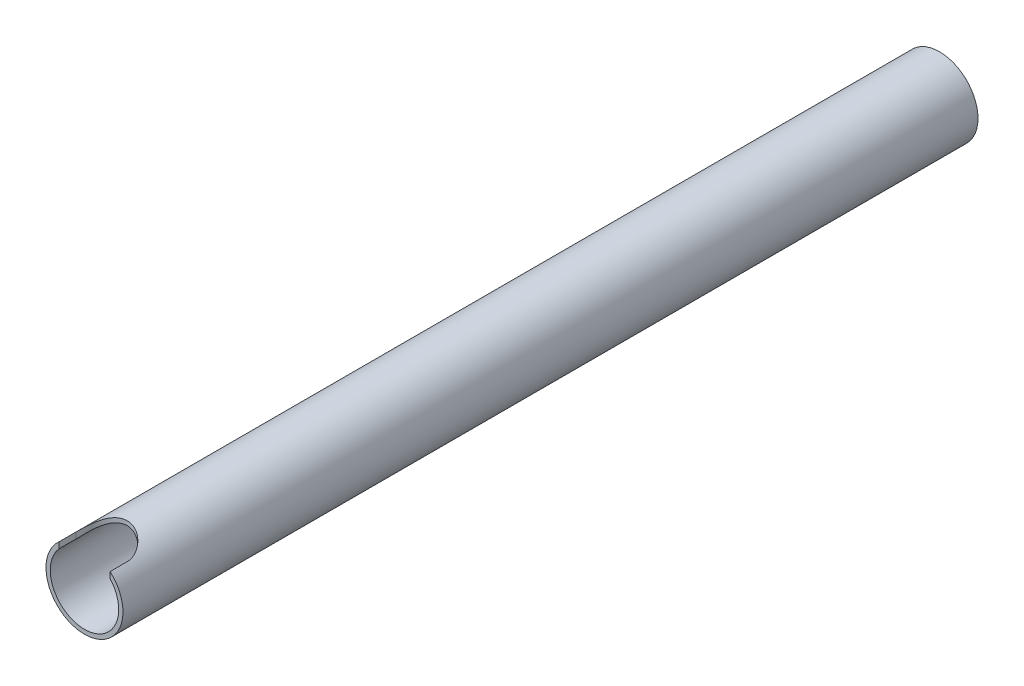
ISO-10303-21;
HEADER;
FILE_DESCRIPTION(('STEP AP214'),'2;1');
FILE_NAME('part.step','',(''),(''),'','','');
FILE_SCHEMA(('AUTOMOTIVE_DESIGN { 1 0 10303 214 1 1 1 1 }'));
ENDSEC;
DATA;
#1=APPLICATION_CONTEXT('core data for automotive mechanical design processes');
#2=APPLICATION_PROTOCOL_DEFINITION('international standard','automotive_design',2000,#1);
#3=PRODUCT_CONTEXT('',#1,'mechanical');
#4=PRODUCT('Part','Part','',(#3));
#5=PRODUCT_RELATED_PRODUCT_CATEGORY('part','',(#4));
#6=PRODUCT_DEFINITION_FORMATION('','',#4);
#7=PRODUCT_DEFINITION_CONTEXT('part definition',#1,'design');
#8=PRODUCT_DEFINITION('design','',#6,#7);
#9=PRODUCT_DEFINITION_SHAPE('','',#8);
#10=(LENGTH_UNIT() NAMED_UNIT(*) SI_UNIT(.MILLI.,.METRE.));
#11=(NAMED_UNIT(*) PLANE_ANGLE_UNIT() SI_UNIT($,.RADIAN.));
#12=(NAMED_UNIT(*) SI_UNIT($,.STERADIAN.) SOLID_ANGLE_UNIT());
#13=UNCERTAINTY_MEASURE_WITH_UNIT(LENGTH_MEASURE(1.E-05),#10,'distance_accuracy_value','');
#14=(GEOMETRIC_REPRESENTATION_CONTEXT(3) GLOBAL_UNCERTAINTY_ASSIGNED_CONTEXT((#13)) GLOBAL_UNIT_ASSIGNED_CONTEXT((#10,
#11,#12)) REPRESENTATION_CONTEXT('',''));
#15=CARTESIAN_POINT('',(0.,0.,0.));
#16=DIRECTION('',(0.,0.,1.));
#17=DIRECTION('',(1.,0.,0.));
#18=AXIS2_PLACEMENT_3D('',#15,#16,#17);
#19=CARTESIAN_POINT('',(0.,0.,200.));
#20=DIRECTION('',(0.,0.,1.));
#21=DIRECTION('',(1.,0.,0.));
#22=AXIS2_PLACEMENT_3D('',#19,#20,#21);
#23=PLANE('',#22);
#24=DIRECTION('',(0.,-1.,0.));
#25=VECTOR('',#24,1.);
#26=CARTESIAN_POINT('',(-6.,0.,200.));
#27=LINE('',#26,#25);
#28=CARTESIAN_POINT('',(-6.,6.70820393249937,200.));
#29=VERTEX_POINT('',#28);
#30=CARTESIAN_POINT('',(-6.,5.29150262212918,200.));
#31=VERTEX_POINT('',#30);
#32=EDGE_CURVE('E118',#29,#31,#27,.T.);
#33=ORIENTED_EDGE('',*,*,#32,.F.);
#34=CARTESIAN_POINT('',(0.,0.,200.));
#35=DIRECTION('',(0.,0.,1.));
#36=DIRECTION('',(1.,0.,0.));
#37=AXIS2_PLACEMENT_3D('',#34,#35,#36);
#38=CIRCLE('',#37,9.);
#39=CARTESIAN_POINT('',(6.,6.70820393249937,200.));
#40=VERTEX_POINT('',#39);
#41=EDGE_CURVE('E177',#29,#40,#38,.T.);
#42=ORIENTED_EDGE('',*,*,#41,.T.);
#43=DIRECTION('',(0.,1.,0.));
#44=VECTOR('',#43,1.);
#45=CARTESIAN_POINT('',(6.,0.,200.));
#46=LINE('',#45,#44);
#47=CARTESIAN_POINT('',(6.,5.29150262212918,200.));
#48=VERTEX_POINT('',#47);
#49=EDGE_CURVE('E103',#48,#40,#46,.T.);
#50=ORIENTED_EDGE('',*,*,#49,.F.);
#51=CARTESIAN_POINT('',(0.,0.,200.));
#52=DIRECTION('',(0.,0.,1.));
#53=DIRECTION('',(1.,0.,0.));
#54=AXIS2_PLACEMENT_3D('',#51,#52,#53);
#55=CIRCLE('',#54,8.);
#56=EDGE_CURVE('E166',#31,#48,#55,.T.);
#57=ORIENTED_EDGE('',*,*,#56,.F.);
#58=EDGE_LOOP('',(#33,#42,#50,#57));
#59=FACE_BOUND('',#58,.T.);
#60=ADVANCED_FACE('F50',(#59),#23,.T.);
#61=CARTESIAN_POINT('',(0.,0.,0.));
#62=DIRECTION('',(0.,0.,1.));
#63=DIRECTION('',(1.,0.,0.));
#64=AXIS2_PLACEMENT_3D('',#61,#62,#63);
#65=PLANE('',#64);
#66=CARTESIAN_POINT('',(0.,0.,0.));
#67=DIRECTION('',(0.,0.,1.));
#68=DIRECTION('',(1.,0.,0.));
#69=AXIS2_PLACEMENT_3D('',#66,#67,#68);
#70=CIRCLE('',#69,9.);
#71=CARTESIAN_POINT('',(9.,0.,0.));
#72=VERTEX_POINT('',#71);
#73=EDGE_CURVE('E162',#72,#72,#70,.T.);
#74=ORIENTED_EDGE('',*,*,#73,.F.);
#75=EDGE_LOOP('',(#74));
#76=FACE_BOUND('',#75,.T.);
#77=CARTESIAN_POINT('',(0.,0.,0.));
#78=DIRECTION('',(0.,0.,1.));
#79=DIRECTION('',(1.,0.,0.));
#80=AXIS2_PLACEMENT_3D('',#77,#78,#79);
#81=CIRCLE('',#80,8.);
#82=CARTESIAN_POINT('',(8.,0.,0.));
#83=VERTEX_POINT('',#82);
#84=EDGE_CURVE('E167',#83,#83,#81,.T.);
#85=ORIENTED_EDGE('',*,*,#84,.T.);
#86=EDGE_LOOP('',(#85));
#87=FACE_BOUND('',#86,.T.);
#88=ADVANCED_FACE('F153',(#76,#87),#65,.F.);
#89=CARTESIAN_POINT('',(0.,0.,200.));
#90=DIRECTION('',(0.,0.,-1.));
#91=DIRECTION('',(-1.,0.,0.));
#92=AXIS2_PLACEMENT_3D('',#89,#90,#91);
#93=CYLINDRICAL_SURFACE('',#92,9.);
#94=ORIENTED_EDGE('',*,*,#41,.F.);
#95=DIRECTION('',(0.,0.,-1.));
#96=VECTOR('',#95,1.);
#97=CARTESIAN_POINT('',(-6.,6.70820393249937,200.));
#98=LINE('',#97,#96);
#99=CARTESIAN_POINT('',(-6.,6.70820393249937,196.));
#100=VERTEX_POINT('',#99);
#101=EDGE_CURVE('E79',#29,#100,#98,.T.);
#102=ORIENTED_EDGE('',*,*,#101,.T.);
#103=CARTESIAN_POINT('',(-6.,6.70820393249937,196.));
#104=CARTESIAN_POINT('',(-6.0000393183433,6.70812194573574,195.852506980731));
#105=CARTESIAN_POINT('',(-5.99456347786238,6.71306593091113,195.705061652411));
#106=CARTESIAN_POINT('',(-5.97289327726244,6.73237859024483,195.411774037341));
#107=CARTESIAN_POINT('',(-5.95671328084198,6.74673463431257,195.265929868277));
#108=CARTESIAN_POINT('',(-5.91415607609064,6.78406215747855,194.978375981598));
#109=CARTESIAN_POINT('',(-5.88788106748825,6.8069472231382,194.836639667377));
#110=CARTESIAN_POINT('',(-5.82560066996816,6.86032556958915,194.556763780513));
#111=CARTESIAN_POINT('',(-5.78959245078331,6.89082106317695,194.418625266884));
#112=CARTESIAN_POINT('',(-5.70858199668009,6.95807725230193,194.147428771933));
#113=CARTESIAN_POINT('',(-5.66362787449207,6.994804284088,194.014347963361));
#114=CARTESIAN_POINT('',(-5.56512538409717,7.07342589112545,193.753028706149));
#115=CARTESIAN_POINT('',(-5.51157745308584,7.11532020347504,193.624790011584));
#116=CARTESIAN_POINT('',(-5.33842689493356,7.24722356567827,193.247177913208));
#117=CARTESIAN_POINT('',(-5.20649519991548,7.34329866853642,193.005493595962));
#118=CARTESIAN_POINT('',(-4.88998497472128,7.55844009542074,192.508915856898));
#119=CARTESIAN_POINT('',(-4.70042231706135,7.67876554502885,192.257747766865));
#120=CARTESIAN_POINT('',(-4.38847297427156,7.85848610554915,191.905379210826));
#121=CARTESIAN_POINT('',(-4.27982876675124,7.91829423228407,191.791937198901));
#122=CARTESIAN_POINT('',(-4.05351803224065,8.03649599254022,191.573519899));
#123=CARTESIAN_POINT('',(-3.93584941894303,8.09488929484438,191.468546580438));
#124=CARTESIAN_POINT('',(-3.67410276883844,8.21734571815794,191.25302928572));
#125=CARTESIAN_POINT('',(-3.52867128211092,8.28100042701004,191.143890846029));
#126=CARTESIAN_POINT('',(-3.22705781179329,8.40312749208883,190.938441866567));
#127=CARTESIAN_POINT('',(-3.07088087836644,8.46160225363382,190.842125362347));
#128=CARTESIAN_POINT('',(-2.7485550368627,8.57172289580967,190.663392008808));
#129=CARTESIAN_POINT('',(-2.58241066290611,8.62337184771766,190.580968903514));
#130=CARTESIAN_POINT('',(-2.24117837103793,8.71828288420858,190.431174670396));
#131=CARTESIAN_POINT('',(-2.06609237981828,8.76154676600818,190.363800316619));
#132=CARTESIAN_POINT('',(-1.72849691899763,8.83395011628131,190.251932590202));
#133=CARTESIAN_POINT('',(-1.56677951763714,8.8641295404735,190.205720420075));
#134=CARTESIAN_POINT('',(-1.23871765597762,8.91589255205311,190.126838317575));
#135=CARTESIAN_POINT('',(-1.0723735087317,8.93747671950317,190.094167471343));
#136=CARTESIAN_POINT('',(-0.736763503715932,8.97137649057705,190.042990402912));
#137=CARTESIAN_POINT('',(-0.567500918238733,8.98370186187713,190.024469252972));
#138=CARTESIAN_POINT('',(-0.227596501670302,8.99872901097531,190.001900549956));
#139=CARTESIAN_POINT('',(-0.056954868589227,9.00143214661064,189.997850954732));
#140=CARTESIAN_POINT('',(0.257909828093748,8.99746462243315,190.003803864367));
#141=CARTESIAN_POINT('',(0.40219455835203,8.99216016134809,190.01175826242));
#142=CARTESIAN_POINT('',(0.689453317178941,8.97470670280735,190.037998856573));
#143=CARTESIAN_POINT('',(0.832426917904149,8.96255554664857,190.056288311231));
#144=CARTESIAN_POINT('',(1.11594062243916,8.93168553622766,190.102940433048));
#145=CARTESIAN_POINT('',(1.25648156409055,8.91296899238517,190.131299556643));
#146=CARTESIAN_POINT('',(1.53431926186213,8.86936580246273,190.197735155283));
#147=CARTESIAN_POINT('',(1.67161473732113,8.84447676380638,190.235815398588));
#148=CARTESIAN_POINT('',(1.94151594437167,8.78916401420626,190.321051852994));
#149=CARTESIAN_POINT('',(2.07413974717568,8.75876529383256,190.368167137181));
#150=CARTESIAN_POINT('',(2.33470201598792,8.69294276948524,190.471092998353));
#151=CARTESIAN_POINT('',(2.46263881729357,8.65751720146291,190.526906628487));
#152=CARTESIAN_POINT('',(2.83849835595443,8.5446597697204,190.706612161669));
#153=CARTESIAN_POINT('',(3.07866953915028,8.46060488844629,190.842832550333));
#154=CARTESIAN_POINT('',(3.56489228702402,8.26853604776286,191.1639488568));
#155=CARTESIAN_POINT('',(3.80756841028923,8.15882511006946,191.35288906415));
#156=CARTESIAN_POINT('',(4.25998331649615,7.93199864466213,191.763721415403));
#157=CARTESIAN_POINT('',(4.46967121585829,7.81487206125219,191.985663457895));
#158=CARTESIAN_POINT('',(4.77234020904544,7.63161953706803,192.359155696051));
#159=CARTESIAN_POINT('',(4.8772295945531,7.56482963236636,192.500887078842));
#160=CARTESIAN_POINT('',(5.07463232509068,7.43385178781524,192.793857940915));
#161=CARTESIAN_POINT('',(5.16714277588728,7.36966445889255,192.945099631629));
#162=CARTESIAN_POINT('',(5.424891961227,7.18436432971937,193.412196144449));
#163=CARTESIAN_POINT('',(5.57088509041259,7.07017210785883,193.742080318463));
#164=CARTESIAN_POINT('',(5.77061895485414,6.90737596649755,194.336081892814));
#165=CARTESIAN_POINT('',(5.83874387569329,6.84936009029308,194.592758129275));
#166=CARTESIAN_POINT('',(5.91517353662353,6.78319958018771,194.985829861502));
#167=CARTESIAN_POINT('',(5.93634841066102,6.76463184262495,195.118054286599));
#168=CARTESIAN_POINT('',(5.96984487292608,6.73509265405631,195.384427253078));
#169=CARTESIAN_POINT('',(5.98217199357155,6.7241164562877,195.518574538489));
#170=CARTESIAN_POINT('',(5.99330844907521,6.71418405629563,195.71085756892));
#171=CARTESIAN_POINT('',(5.99581719087049,6.71194322091241,195.768644375282));
#172=CARTESIAN_POINT('',(5.99916266713708,6.70895310557702,195.884284727289));
#173=CARTESIAN_POINT('',(5.99999998296912,6.708203307008,195.942138242723));
#174=CARTESIAN_POINT('',(6.,6.70820393249937,196.));
#175=B_SPLINE_CURVE_WITH_KNOTS('',3,(#103,#104,#105,#106,#107,#108,#109,#110,#111,#112,#113,
#114,#115,#116,#117,#118,#119,#120,#121,#122,#123,#124,#125,#126,#127,#128,#129,#130,#131,#132,
#133,#134,#135,#136,#137,#138,#139,#140,#141,#142,#143,#144,#145,#146,#147,#148,#149,#150,#151,
#152,#153,#154,#155,#156,#157,#158,#159,#160,#161,#162,#163,#164,#165,#166,#167,#168,#169,#170,
#171,#172,#173,#174),.UNSPECIFIED.,.F.,.F.,(4,2,2,2,2,2,2,2,2,2,2,2,2,2,2,2,2,2,2,2,2,2,2,2,2,2,
2,2,2,2,2,2,2,2,2,4),(0.,0.442218902060999,0.883845599550486,1.32111440562802,1.75851049975334,
2.19361485357492,2.62869707920835,3.50073479655623,4.50746081603578,5.01131940006734,
5.5152948218338,6.09247253881144,6.66938082173012,7.2460286341691,7.82255271359904,
8.33441185130012,8.84623643963211,9.35752031133303,9.86873203059137,10.3020102889807,
10.7354252327199,11.1686878065584,11.6021185844215,12.0336305045627,12.4652942294365,
13.3279876664779,14.3040591784731,15.2816218010343,15.8466542882344,16.411818651815,
17.5394361699494,18.3513876988232,18.7565175336659,19.1613938233755,19.3350122681653,
19.5085703139019),.UNSPECIFIED.);
#176=CARTESIAN_POINT('',(6.,6.70820393249937,196.));
#177=VERTEX_POINT('',#176);
#178=EDGE_CURVE('E108',#100,#177,#175,.T.);
#179=ORIENTED_EDGE('',*,*,#178,.T.);
#180=DIRECTION('',(0.,0.,-1.));
#181=VECTOR('',#180,1.);
#182=CARTESIAN_POINT('',(6.,6.70820393249937,200.));
#183=LINE('',#182,#181);
#184=EDGE_CURVE('E99',#177,#40,#183,.F.);
#185=ORIENTED_EDGE('',*,*,#184,.T.);
#186=EDGE_LOOP('',(#94,#102,#179,#185));
#187=FACE_BOUND('',#186,.T.);
#188=ORIENTED_EDGE('',*,*,#73,.T.);
#189=EDGE_LOOP('',(#188));
#190=FACE_BOUND('',#189,.T.);
#191=ADVANCED_FACE('F47',(#187,#190),#93,.T.);
#192=CARTESIAN_POINT('',(0.,0.,200.));
#193=DIRECTION('',(0.,0.,-1.));
#194=DIRECTION('',(-1.,0.,0.));
#195=AXIS2_PLACEMENT_3D('',#192,#193,#194);
#196=CYLINDRICAL_SURFACE('',#195,8.);
#197=DIRECTION('',(0.,0.,-1.));
#198=VECTOR('',#197,1.);
#199=CARTESIAN_POINT('',(-6.,5.29150262212918,200.));
#200=LINE('',#199,#198);
#201=CARTESIAN_POINT('',(-6.,5.29150262212918,196.));
#202=VERTEX_POINT('',#201);
#203=EDGE_CURVE('E11',#31,#202,#200,.T.);
#204=ORIENTED_EDGE('',*,*,#203,.F.);
#205=ORIENTED_EDGE('',*,*,#56,.T.);
#206=DIRECTION('',(0.,0.,-1.));
#207=VECTOR('',#206,1.);
#208=CARTESIAN_POINT('',(6.,5.29150262212918,200.));
#209=LINE('',#208,#207);
#210=CARTESIAN_POINT('',(6.,5.29150262212918,196.));
#211=VERTEX_POINT('',#210);
#212=EDGE_CURVE('E144',#211,#48,#209,.F.);
#213=ORIENTED_EDGE('',*,*,#212,.F.);
#214=CARTESIAN_POINT('',(-6.,5.29150262212918,196.));
#215=CARTESIAN_POINT('',(-6.00000164734553,5.29149746130063,195.929299215689));
#216=CARTESIAN_POINT('',(-5.99874992483121,5.29292042134915,195.858612431604));
#217=CARTESIAN_POINT('',(-5.99375929848811,5.29857251101417,195.717450627859));
#218=CARTESIAN_POINT('',(-5.99002081044604,5.30280117151782,195.646975574775));
#219=CARTESIAN_POINT('',(-5.97512726223536,5.31959499598561,195.436438424863));
#220=CARTESIAN_POINT('',(-5.96029391667244,5.33626847732026,195.296930503187));
#221=CARTESIAN_POINT('',(-5.92146467708413,5.37931891935372,195.02264831947));
#222=CARTESIAN_POINT('',(-5.89758872729309,5.40556869603609,194.887836295229));
#223=CARTESIAN_POINT('',(-5.84118213277231,5.46647153069185,194.621931044734));
#224=CARTESIAN_POINT('',(-5.80864733570754,5.50112861966951,194.49083963616));
#225=CARTESIAN_POINT('',(-5.73578091551817,5.57705609976159,194.234076022853));
#226=CARTESIAN_POINT('',(-5.69551468906141,5.61827055638512,194.108368480834));
#227=CARTESIAN_POINT('',(-5.60752977965139,5.70609193113432,193.861596067816));
#228=CARTESIAN_POINT('',(-5.55981184109297,5.7526983105091,193.740530734582));
#229=CARTESIAN_POINT('',(-5.40571853410941,5.89900121175978,193.383599325024));
#230=CARTESIAN_POINT('',(-5.28863395224688,6.00493049059014,193.154793376452));
#231=CARTESIAN_POINT('',(-5.08003235744934,6.18093054783945,192.803606798809));
#232=CARTESIAN_POINT('',(-4.99673902321449,6.24859868310512,192.674948483868));
#233=CARTESIAN_POINT('',(-4.82093036772026,6.38521973153118,192.424807481964));
#234=CARTESIAN_POINT('',(-4.72841432126793,6.45417274537597,192.303325360472));
#235=CARTESIAN_POINT('',(-4.43720798879207,6.66090963382174,191.949759541453));
#236=CARTESIAN_POINT('',(-4.22484445848777,6.79858453976931,191.728531124821));
#237=CARTESIAN_POINT('',(-3.85677854448346,7.01077089521444,191.400035472149));
#238=CARTESIAN_POINT('',(-3.71206447027489,7.08865432832994,191.282400060903));
#239=CARTESIAN_POINT('',(-3.41024785229984,7.23868552108811,191.05982239082));
#240=CARTESIAN_POINT('',(-3.25314252757324,7.31083198584902,190.954882994809));
#241=CARTESIAN_POINT('',(-2.92748738140682,7.44721036286365,190.759213349274));
#242=CARTESIAN_POINT('',(-2.75895787294117,7.5114557793649,190.668458781422));
#243=CARTESIAN_POINT('',(-2.41119946943849,7.6301911953997,190.502438157635));
#244=CARTESIAN_POINT('',(-2.2319763013099,7.68468635517768,190.427163905697));
#245=CARTESIAN_POINT('',(-1.91981544570525,7.76736517405681,190.313791142147));
#246=CARTESIAN_POINT('',(-1.78923137620704,7.79852622386618,190.271328994596));
#247=CARTESIAN_POINT('',(-1.52422909700309,7.85461977621466,190.195198861307));
#248=CARTESIAN_POINT('',(-1.3898118140051,7.87955377020367,190.161528769686));
#249=CARTESIAN_POINT('',(-1.1180230429965,7.92268544907432,190.103448250311));
#250=CARTESIAN_POINT('',(-0.980653655025508,7.94088776510486,190.079031456338));
#251=CARTESIAN_POINT('',(-0.703792112495761,7.9701977558813,190.03977994756));
#252=CARTESIAN_POINT('',(-0.564299882018418,7.9813051762812,190.024945576277));
#253=CARTESIAN_POINT('',(-0.283857320899895,7.99619868039414,190.005065723171));
#254=CARTESIAN_POINT('',(-0.142904119696008,7.99996542591576,190.000046097089));
#255=CARTESIAN_POINT('',(0.139006716824936,8.00003409940456,189.999954535817));
#256=CARTESIAN_POINT('',(0.279964352122297,7.99633605683647,190.004882561363));
#257=CARTESIAN_POINT('',(0.56082213053902,7.98155736180775,190.024608757108));
#258=CARTESIAN_POINT('',(0.700722059237648,7.97047525097633,190.03940887707));
#259=CARTESIAN_POINT('',(0.978397724164498,7.94117321022885,190.07864865745));
#260=CARTESIAN_POINT('',(1.11617347450189,7.92295332774438,190.103088253812));
#261=CARTESIAN_POINT('',(1.3839551510545,7.88050768014737,190.160243554479));
#262=CARTESIAN_POINT('',(1.51406502760778,7.85651130758527,190.192643953359));
#263=CARTESIAN_POINT('',(1.77072992844799,7.8026752011739,190.265687098327));
#264=CARTESIAN_POINT('',(1.89728371438224,7.7728334599092,190.306332676143));
#265=CARTESIAN_POINT('',(2.27058720904833,7.67531280863459,190.439948434221));
#266=CARTESIAN_POINT('',(2.51116863882605,7.59960732816932,190.544638930134));
#267=CARTESIAN_POINT('',(2.9969153602917,7.42243473030987,190.794130794891));
#268=CARTESIAN_POINT('',(3.23975440607125,7.31906538668208,190.942048607236));
#269=CARTESIAN_POINT('',(3.69829736350047,7.09840449015697,191.266963816457));
#270=CARTESIAN_POINT('',(3.91398034333128,6.98110233158908,191.443983405509));
#271=CARTESIAN_POINT('',(4.23583596963117,6.78804083470792,191.747338267198));
#272=CARTESIAN_POINT('',(4.35122114890484,6.71450091073725,191.865505604413));
#273=CARTESIAN_POINT('',(4.57160313183084,6.56643304982319,192.110579711394));
#274=CARTESIAN_POINT('',(4.67660176414746,6.49190528942867,192.237484936064));
#275=CARTESIAN_POINT('',(4.87611364252768,6.34342206895683,192.499896498755));
#276=CARTESIAN_POINT('',(4.97061341127991,6.26946745530601,192.635413548974));
#277=CARTESIAN_POINT('',(5.14865041086736,6.12409941254336,192.914741514764));
#278=CARTESIAN_POINT('',(5.23219013690457,6.05268540773531,193.058550531787));
#279=CARTESIAN_POINT('',(5.37254365577724,5.92813404110711,193.325338733702));
#280=CARTESIAN_POINT('',(5.43138438442486,5.87416125485588,193.446863733178));
#281=CARTESIAN_POINT('',(5.5413408736172,5.77055000888551,193.695225150725));
#282=CARTESIAN_POINT('',(5.59245427231992,5.72091287629918,193.822063177644));
#283=CARTESIAN_POINT('',(5.68625012211941,5.62769176245618,194.08027559041));
#284=CARTESIAN_POINT('',(5.72896954127146,5.58408150227078,194.211626948687));
#285=CARTESIAN_POINT('',(5.80567365362211,5.5042910727892,194.478991477923));
#286=CARTESIAN_POINT('',(5.83966483280454,5.46810539030669,194.615001101627));
#287=CARTESIAN_POINT('',(5.89031205286352,5.41342854550062,194.853374139022));
#288=CARTESIAN_POINT('',(5.90916723672386,5.39280369759212,194.954785604311));
#289=CARTESIAN_POINT('',(5.94171986779775,5.35691605972682,195.159352566744));
#290=CARTESIAN_POINT('',(5.95541890485186,5.34165161704606,195.262507516037));
#291=CARTESIAN_POINT('',(5.97755949694622,5.31686736002835,195.470990602493));
#292=CARTESIAN_POINT('',(5.98595443847325,5.30739850056437,195.57632982725));
#293=CARTESIAN_POINT('',(5.99718514551604,5.29469401011652,195.787772528299));
#294=CARTESIAN_POINT('',(6.00001580245987,5.2914641071683,195.893876617216));
#295=CARTESIAN_POINT('',(6.,5.29150262212919,196.));
#296=B_SPLINE_CURVE_WITH_KNOTS('',3,(#214,#215,#216,#217,#218,#219,#220,#221,#222,#223,#224,
#225,#226,#227,#228,#229,#230,#231,#232,#233,#234,#235,#236,#237,#238,#239,#240,#241,#242,#243,
#244,#245,#246,#247,#248,#249,#250,#251,#252,#253,#254,#255,#256,#257,#258,#259,#260,#261,#262,
#263,#264,#265,#266,#267,#268,#269,#270,#271,#272,#273,#274,#275,#276,#277,#278,#279,#280,#281,
#282,#283,#284,#285,#286,#287,#288,#289,#290,#291,#292,#293,#294,#295),.UNSPECIFIED.,.F.,.F.,(4,
2,2,2,2,2,2,2,2,2,2,2,2,2,2,2,2,2,2,2,2,2,2,2,2,2,2,2,2,2,2,2,2,2,2,2,2,2,2,2,4),(0.,
0.212049935582529,0.42406442536758,0.847096983047166,1.26470438079724,1.68251240342031,
2.09693077200734,2.51130776838553,3.34263552478065,3.84490978127099,4.34722356338937,
5.35175523229734,5.957376761797,6.56313459941825,7.16784226315849,7.7722289374483,
8.19422783459786,8.61612556112341,9.03773249507414,9.45935454242826,9.88208581267284,
10.3048154143323,10.7276285308357,11.1504388377281,11.5586328901709,11.9669673710899,
12.7830530944666,13.6875367840661,14.5927134337423,15.1346425174526,15.6764760182129,
16.2189972201063,16.7613946945816,17.1972953536469,17.6333289766275,18.0673969560296,
18.5011414384825,18.8164661754747,19.1316936057844,19.4496541383768,19.7679064545729),.UNSPECIFIED.);
#297=EDGE_CURVE('E60',#202,#211,#296,.T.);
#298=ORIENTED_EDGE('',*,*,#297,.F.);
#299=EDGE_LOOP('',(#204,#205,#213,#298));
#300=FACE_BOUND('',#299,.T.);
#301=ORIENTED_EDGE('',*,*,#84,.F.);
#302=EDGE_LOOP('',(#301));
#303=FACE_BOUND('',#302,.T.);
#304=ADVANCED_FACE('F150',(#300,#303),#196,.F.);
#305=CARTESIAN_POINT('',(-6.,0.,204.));
#306=DIRECTION('',(-1.,0.,0.));
#307=DIRECTION('',(0.,0.,1.));
#308=AXIS2_PLACEMENT_3D('',#305,#306,#307);
#309=PLANE('',#308);
#310=ORIENTED_EDGE('',*,*,#32,.T.);
#311=ORIENTED_EDGE('',*,*,#203,.T.);
#312=DIRECTION('',(0.,1.,0.));
#313=VECTOR('',#312,1.);
#314=CARTESIAN_POINT('',(-6.,0.,196.));
#315=LINE('',#314,#313);
#316=EDGE_CURVE('E117',#202,#100,#315,.T.);
#317=ORIENTED_EDGE('',*,*,#316,.T.);
#318=ORIENTED_EDGE('',*,*,#101,.F.);
#319=EDGE_LOOP('',(#310,#311,#317,#318));
#320=FACE_BOUND('',#319,.T.);
#321=ADVANCED_FACE('F136',(#320),#309,.F.);
#322=CARTESIAN_POINT('',(0.,0.,196.));
#323=DIRECTION('',(0.,1.,0.));
#324=DIRECTION('',(0.,0.,1.));
#325=AXIS2_PLACEMENT_3D('',#322,#323,#324);
#326=CYLINDRICAL_SURFACE('',#325,6.);
#327=ORIENTED_EDGE('',*,*,#316,.F.);
#328=ORIENTED_EDGE('',*,*,#297,.T.);
#329=DIRECTION('',(0.,1.,0.));
#330=VECTOR('',#329,1.);
#331=CARTESIAN_POINT('',(6.,0.,196.));
#332=LINE('',#331,#330);
#333=EDGE_CURVE('E69',#211,#177,#332,.T.);
#334=ORIENTED_EDGE('',*,*,#333,.T.);
#335=ORIENTED_EDGE('',*,*,#178,.F.);
#336=EDGE_LOOP('',(#327,#328,#334,#335));
#337=FACE_BOUND('',#336,.T.);
#338=ADVANCED_FACE('F114',(#337),#326,.F.);
#339=CARTESIAN_POINT('',(6.,0.,204.));
#340=DIRECTION('',(1.,0.,0.));
#341=DIRECTION('',(0.,0.,-1.));
#342=AXIS2_PLACEMENT_3D('',#339,#340,#341);
#343=PLANE('',#342);
#344=ORIENTED_EDGE('',*,*,#333,.F.);
#345=ORIENTED_EDGE('',*,*,#212,.T.);
#346=ORIENTED_EDGE('',*,*,#49,.T.);
#347=ORIENTED_EDGE('',*,*,#184,.F.);
#348=EDGE_LOOP('',(#344,#345,#346,#347));
#349=FACE_BOUND('',#348,.T.);
#350=ADVANCED_FACE('F101',(#349),#343,.F.);
#351=CLOSED_SHELL('',(#60,#88,#191,#304,#321,#338,#350));
#352=MANIFOLD_SOLID_BREP('B2',#351);
#353=ADVANCED_BREP_SHAPE_REPRESENTATION('',(#18,#352),#14);
#354=SHAPE_DEFINITION_REPRESENTATION(#9,#353);
ENDSEC;
END-ISO-10303-21;
